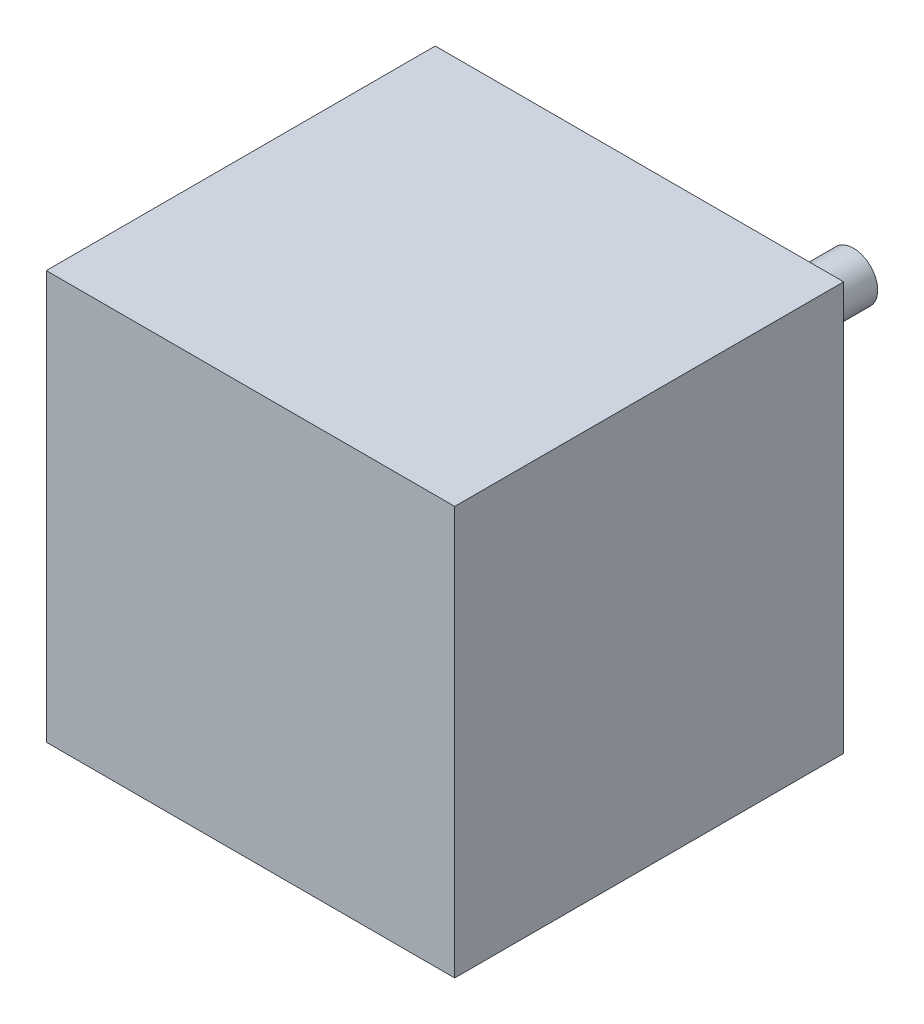
ISO-10303-21;
HEADER;
FILE_DESCRIPTION(('STEP AP214'),'2;1');
FILE_NAME('part.step','',(''),(''),'','','');
FILE_SCHEMA(('AUTOMOTIVE_DESIGN { 1 0 10303 214 1 1 1 1 }'));
ENDSEC;
DATA;
#1=APPLICATION_CONTEXT('core data for automotive mechanical design processes');
#2=APPLICATION_PROTOCOL_DEFINITION('international standard','automotive_design',2000,#1);
#3=PRODUCT_CONTEXT('',#1,'mechanical');
#4=PRODUCT('Part','Part','',(#3));
#5=PRODUCT_RELATED_PRODUCT_CATEGORY('part','',(#4));
#6=PRODUCT_DEFINITION_FORMATION('','',#4);
#7=PRODUCT_DEFINITION_CONTEXT('part definition',#1,'design');
#8=PRODUCT_DEFINITION('design','',#6,#7);
#9=PRODUCT_DEFINITION_SHAPE('','',#8);
#10=(LENGTH_UNIT() NAMED_UNIT(*) SI_UNIT(.MILLI.,.METRE.));
#11=(NAMED_UNIT(*) PLANE_ANGLE_UNIT() SI_UNIT($,.RADIAN.));
#12=(NAMED_UNIT(*) SI_UNIT($,.STERADIAN.) SOLID_ANGLE_UNIT());
#13=UNCERTAINTY_MEASURE_WITH_UNIT(LENGTH_MEASURE(1.E-05),#10,'distance_accuracy_value','');
#14=(GEOMETRIC_REPRESENTATION_CONTEXT(3) GLOBAL_UNCERTAINTY_ASSIGNED_CONTEXT((#13)) GLOBAL_UNIT_ASSIGNED_CONTEXT((#10,
#11,#12)) REPRESENTATION_CONTEXT('',''));
#15=CARTESIAN_POINT('',(0.,0.,0.));
#16=DIRECTION('',(0.,0.,1.));
#17=DIRECTION('',(1.,0.,0.));
#18=AXIS2_PLACEMENT_3D('',#15,#16,#17);
#19=CARTESIAN_POINT('',(0.,0.,-22.));
#20=DIRECTION('',(0.,0.,-1.));
#21=DIRECTION('',(0.,-1.,0.));
#22=AXIS2_PLACEMENT_3D('',#19,#20,#21);
#23=PLANE('',#22);
#24=CARTESIAN_POINT('',(0.,0.,-22.));
#25=DIRECTION('',(0.,0.,-1.));
#26=DIRECTION('',(1.,0.,0.));
#27=AXIS2_PLACEMENT_3D('',#24,#25,#26);
#28=CIRCLE('',#27,2.5);
#29=CARTESIAN_POINT('',(2.5,0.,-22.));
#30=VERTEX_POINT('',#29);
#31=EDGE_CURVE('E10',#30,#30,#28,.T.);
#32=ORIENTED_EDGE('',*,*,#31,.T.);
#33=EDGE_LOOP('',(#32));
#34=FACE_BOUND('',#33,.T.);
#35=ADVANCED_FACE('F16',(#34),#23,.T.);
#36=CARTESIAN_POINT('',(0.,0.,0.));
#37=DIRECTION('',(0.,0.,-1.));
#38=DIRECTION('',(1.,0.,0.));
#39=AXIS2_PLACEMENT_3D('',#36,#37,#38);
#40=CYLINDRICAL_SURFACE('',#39,2.5);
#41=ORIENTED_EDGE('',*,*,#31,.F.);
#42=EDGE_LOOP('',(#41));
#43=FACE_BOUND('',#42,.T.);
#44=CARTESIAN_POINT('',(0.,0.,0.));
#45=DIRECTION('',(0.,0.,-1.));
#46=DIRECTION('',(1.,0.,0.));
#47=AXIS2_PLACEMENT_3D('',#44,#45,#46);
#48=CIRCLE('',#47,2.5);
#49=CARTESIAN_POINT('',(2.5,0.,0.));
#50=VERTEX_POINT('',#49);
#51=EDGE_CURVE('E114',#50,#50,#48,.T.);
#52=ORIENTED_EDGE('',*,*,#51,.T.);
#53=EDGE_LOOP('',(#52));
#54=FACE_BOUND('',#53,.T.);
#55=ADVANCED_FACE('F125',(#43,#54),#40,.T.);
#56=CARTESIAN_POINT('',(21.,21.,40.));
#57=DIRECTION('',(1.,0.,0.));
#58=DIRECTION('',(0.,1.,0.));
#59=AXIS2_PLACEMENT_3D('',#56,#57,#58);
#60=PLANE('',#59);
#61=DIRECTION('',(0.,0.,-1.));
#62=VECTOR('',#61,1.);
#63=CARTESIAN_POINT('',(21.,21.,40.));
#64=LINE('',#63,#62);
#65=CARTESIAN_POINT('',(21.,21.,40.));
#66=VERTEX_POINT('',#65);
#67=CARTESIAN_POINT('',(21.,21.,0.));
#68=VERTEX_POINT('',#67);
#69=EDGE_CURVE('E75',#66,#68,#64,.T.);
#70=ORIENTED_EDGE('',*,*,#69,.F.);
#71=DIRECTION('',(0.,-1.,0.));
#72=VECTOR('',#71,1.);
#73=CARTESIAN_POINT('',(21.,21.,40.));
#74=LINE('',#73,#72);
#75=CARTESIAN_POINT('',(21.,-21.,40.));
#76=VERTEX_POINT('',#75);
#77=EDGE_CURVE('E24',#66,#76,#74,.T.);
#78=ORIENTED_EDGE('',*,*,#77,.T.);
#79=DIRECTION('',(0.,0.,-1.));
#80=VECTOR('',#79,1.);
#81=CARTESIAN_POINT('',(21.,-21.,40.));
#82=LINE('',#81,#80);
#83=CARTESIAN_POINT('',(21.,-21.,0.));
#84=VERTEX_POINT('',#83);
#85=EDGE_CURVE('E41',#76,#84,#82,.T.);
#86=ORIENTED_EDGE('',*,*,#85,.T.);
#87=DIRECTION('',(0.,-1.,0.));
#88=VECTOR('',#87,1.);
#89=CARTESIAN_POINT('',(21.,21.,0.));
#90=LINE('',#89,#88);
#91=EDGE_CURVE('E107',#68,#84,#90,.T.);
#92=ORIENTED_EDGE('',*,*,#91,.F.);
#93=EDGE_LOOP('',(#70,#78,#86,#92));
#94=FACE_BOUND('',#93,.T.);
#95=ADVANCED_FACE('F145',(#94),#60,.T.);
#96=CARTESIAN_POINT('',(-21.,21.,40.));
#97=DIRECTION('',(0.,0.,-1.));
#98=DIRECTION('',(0.,-1.,0.));
#99=AXIS2_PLACEMENT_3D('',#96,#97,#98);
#100=PLANE('',#99);
#101=DIRECTION('',(1.,0.,0.));
#102=VECTOR('',#101,1.);
#103=CARTESIAN_POINT('',(-21.,-21.,40.));
#104=LINE('',#103,#102);
#105=CARTESIAN_POINT('',(-21.,-21.,40.));
#106=VERTEX_POINT('',#105);
#107=EDGE_CURVE('E110',#106,#76,#104,.T.);
#108=ORIENTED_EDGE('',*,*,#107,.T.);
#109=ORIENTED_EDGE('',*,*,#77,.F.);
#110=DIRECTION('',(1.,0.,0.));
#111=VECTOR('',#110,1.);
#112=CARTESIAN_POINT('',(-21.,21.,40.));
#113=LINE('',#112,#111);
#114=CARTESIAN_POINT('',(-21.,21.,40.));
#115=VERTEX_POINT('',#114);
#116=EDGE_CURVE('E80',#115,#66,#113,.T.);
#117=ORIENTED_EDGE('',*,*,#116,.F.);
#118=DIRECTION('',(0.,-1.,0.));
#119=VECTOR('',#118,1.);
#120=CARTESIAN_POINT('',(-21.,21.,40.));
#121=LINE('',#120,#119);
#122=EDGE_CURVE('E88',#115,#106,#121,.T.);
#123=ORIENTED_EDGE('',*,*,#122,.T.);
#124=EDGE_LOOP('',(#108,#109,#117,#123));
#125=FACE_BOUND('',#124,.T.);
#126=ADVANCED_FACE('F136',(#125),#100,.F.);
#127=CARTESIAN_POINT('',(-21.,-21.,40.));
#128=DIRECTION('',(0.,-1.,0.));
#129=DIRECTION('',(-1.,0.,0.));
#130=AXIS2_PLACEMENT_3D('',#127,#128,#129);
#131=PLANE('',#130);
#132=ORIENTED_EDGE('',*,*,#107,.F.);
#133=DIRECTION('',(0.,0.,-1.));
#134=VECTOR('',#133,1.);
#135=CARTESIAN_POINT('',(-21.,-21.,40.));
#136=LINE('',#135,#134);
#137=CARTESIAN_POINT('',(-21.,-21.,0.));
#138=VERTEX_POINT('',#137);
#139=EDGE_CURVE('E95',#106,#138,#136,.T.);
#140=ORIENTED_EDGE('',*,*,#139,.T.);
#141=DIRECTION('',(1.,0.,0.));
#142=VECTOR('',#141,1.);
#143=CARTESIAN_POINT('',(-21.,-21.,0.));
#144=LINE('',#143,#142);
#145=EDGE_CURVE('E92',#138,#84,#144,.T.);
#146=ORIENTED_EDGE('',*,*,#145,.T.);
#147=ORIENTED_EDGE('',*,*,#85,.F.);
#148=EDGE_LOOP('',(#132,#140,#146,#147));
#149=FACE_BOUND('',#148,.T.);
#150=ADVANCED_FACE('F128',(#149),#131,.T.);
#151=CARTESIAN_POINT('',(-21.,21.,0.));
#152=DIRECTION('',(0.,0.,-1.));
#153=DIRECTION('',(0.,-1.,0.));
#154=AXIS2_PLACEMENT_3D('',#151,#152,#153);
#155=PLANE('',#154);
#156=ORIENTED_EDGE('',*,*,#51,.F.);
#157=EDGE_LOOP('',(#156));
#158=FACE_BOUND('',#157,.T.);
#159=DIRECTION('',(0.,-1.,0.));
#160=VECTOR('',#159,1.);
#161=CARTESIAN_POINT('',(-21.,21.,0.));
#162=LINE('',#161,#160);
#163=CARTESIAN_POINT('',(-21.,21.,0.));
#164=VERTEX_POINT('',#163);
#165=EDGE_CURVE('E86',#164,#138,#162,.T.);
#166=ORIENTED_EDGE('',*,*,#165,.F.);
#167=DIRECTION('',(1.,0.,0.));
#168=VECTOR('',#167,1.);
#169=CARTESIAN_POINT('',(-21.,21.,0.));
#170=LINE('',#169,#168);
#171=EDGE_CURVE('E69',#164,#68,#170,.T.);
#172=ORIENTED_EDGE('',*,*,#171,.T.);
#173=ORIENTED_EDGE('',*,*,#91,.T.);
#174=ORIENTED_EDGE('',*,*,#145,.F.);
#175=EDGE_LOOP('',(#166,#172,#173,#174));
#176=FACE_BOUND('',#175,.T.);
#177=ADVANCED_FACE('F91',(#158,#176),#155,.T.);
#178=CARTESIAN_POINT('',(-21.,21.,40.));
#179=DIRECTION('',(0.,-1.,0.));
#180=DIRECTION('',(-1.,0.,0.));
#181=AXIS2_PLACEMENT_3D('',#178,#179,#180);
#182=PLANE('',#181);
#183=ORIENTED_EDGE('',*,*,#69,.T.);
#184=ORIENTED_EDGE('',*,*,#171,.F.);
#185=DIRECTION('',(0.,0.,-1.));
#186=VECTOR('',#185,1.);
#187=CARTESIAN_POINT('',(-21.,21.,40.));
#188=LINE('',#187,#186);
#189=EDGE_CURVE('E73',#115,#164,#188,.T.);
#190=ORIENTED_EDGE('',*,*,#189,.F.);
#191=ORIENTED_EDGE('',*,*,#116,.T.);
#192=EDGE_LOOP('',(#183,#184,#190,#191));
#193=FACE_BOUND('',#192,.T.);
#194=ADVANCED_FACE('F71',(#193),#182,.F.);
#195=CARTESIAN_POINT('',(-21.,21.,40.));
#196=DIRECTION('',(1.,0.,0.));
#197=DIRECTION('',(0.,1.,0.));
#198=AXIS2_PLACEMENT_3D('',#195,#196,#197);
#199=PLANE('',#198);
#200=ORIENTED_EDGE('',*,*,#165,.T.);
#201=ORIENTED_EDGE('',*,*,#139,.F.);
#202=ORIENTED_EDGE('',*,*,#122,.F.);
#203=ORIENTED_EDGE('',*,*,#189,.T.);
#204=EDGE_LOOP('',(#200,#201,#202,#203));
#205=FACE_BOUND('',#204,.T.);
#206=ADVANCED_FACE('F84',(#205),#199,.F.);
#207=CLOSED_SHELL('',(#35,#55,#95,#126,#150,#177,#194,#206));
#208=MANIFOLD_SOLID_BREP('B1',#207);
#209=ADVANCED_BREP_SHAPE_REPRESENTATION('',(#18,#208),#14);
#210=SHAPE_DEFINITION_REPRESENTATION(#9,#209);
ENDSEC;
END-ISO-10303-21;
